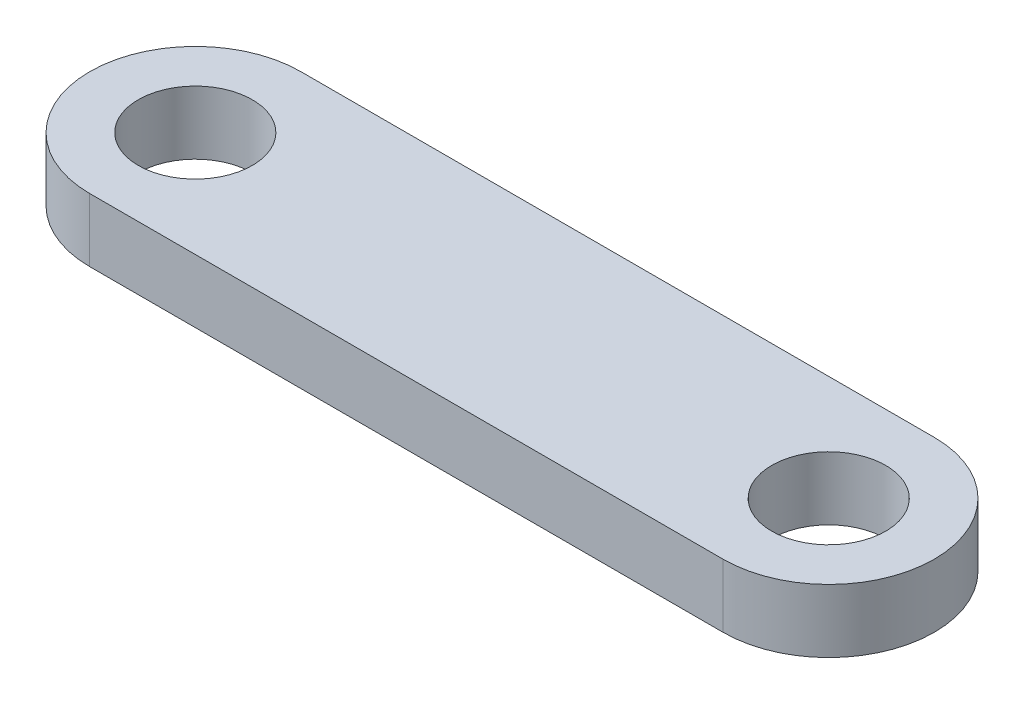
ISO-10303-21;
HEADER;
FILE_DESCRIPTION(('STEP AP214'),'2;1');
FILE_NAME('part.step','',(''),(''),'','','');
FILE_SCHEMA(('AUTOMOTIVE_DESIGN { 1 0 10303 214 1 1 1 1 }'));
ENDSEC;
DATA;
#1=APPLICATION_CONTEXT('core data for automotive mechanical design processes');
#2=APPLICATION_PROTOCOL_DEFINITION('international standard','automotive_design',2000,#1);
#3=PRODUCT_CONTEXT('',#1,'mechanical');
#4=PRODUCT('Part','Part','',(#3));
#5=PRODUCT_RELATED_PRODUCT_CATEGORY('part','',(#4));
#6=PRODUCT_DEFINITION_FORMATION('','',#4);
#7=PRODUCT_DEFINITION_CONTEXT('part definition',#1,'design');
#8=PRODUCT_DEFINITION('design','',#6,#7);
#9=PRODUCT_DEFINITION_SHAPE('','',#8);
#10=(LENGTH_UNIT() NAMED_UNIT(*) SI_UNIT(.MILLI.,.METRE.));
#11=(NAMED_UNIT(*) PLANE_ANGLE_UNIT() SI_UNIT($,.RADIAN.));
#12=(NAMED_UNIT(*) SI_UNIT($,.STERADIAN.) SOLID_ANGLE_UNIT());
#13=UNCERTAINTY_MEASURE_WITH_UNIT(LENGTH_MEASURE(1.E-05),#10,'distance_accuracy_value','');
#14=(GEOMETRIC_REPRESENTATION_CONTEXT(3) GLOBAL_UNCERTAINTY_ASSIGNED_CONTEXT((#13)) GLOBAL_UNIT_ASSIGNED_CONTEXT((#10,
#11,#12)) REPRESENTATION_CONTEXT('',''));
#15=CARTESIAN_POINT('',(0.,0.,0.));
#16=DIRECTION('',(0.,0.,1.));
#17=DIRECTION('',(1.,0.,0.));
#18=AXIS2_PLACEMENT_3D('',#15,#16,#17);
#19=CARTESIAN_POINT('',(0.,3.,0.));
#20=DIRECTION('',(0.,1.,0.));
#21=DIRECTION('',(0.,0.,1.));
#22=AXIS2_PLACEMENT_3D('',#19,#20,#21);
#23=PLANE('',#22);
#24=CARTESIAN_POINT('',(0.,3.,0.));
#25=DIRECTION('',(0.,1.,0.));
#26=DIRECTION('',(0.,0.,1.));
#27=AXIS2_PLACEMENT_3D('',#24,#25,#26);
#28=CIRCLE('',#27,2.7);
#29=CARTESIAN_POINT('',(0.,3.,2.7));
#30=VERTEX_POINT('',#29);
#31=EDGE_CURVE('E102',#30,#30,#28,.T.);
#32=ORIENTED_EDGE('',*,*,#31,.F.);
#33=EDGE_LOOP('',(#32));
#34=FACE_BOUND('',#33,.T.);
#35=CARTESIAN_POINT('',(0.,3.,0.));
#36=DIRECTION('',(0.,1.,0.));
#37=DIRECTION('',(0.,0.,1.));
#38=AXIS2_PLACEMENT_3D('',#35,#36,#37);
#39=CIRCLE('',#38,5.);
#40=CARTESIAN_POINT('',(0.,3.,-5.));
#41=VERTEX_POINT('',#40);
#42=CARTESIAN_POINT('',(0.,3.,5.));
#43=VERTEX_POINT('',#42);
#44=EDGE_CURVE('E87',#41,#43,#39,.T.);
#45=ORIENTED_EDGE('',*,*,#44,.T.);
#46=DIRECTION('',(1.,0.,0.));
#47=VECTOR('',#46,1.);
#48=CARTESIAN_POINT('',(0.,3.,5.));
#49=LINE('',#48,#47);
#50=CARTESIAN_POINT('',(30.,3.,5.));
#51=VERTEX_POINT('',#50);
#52=EDGE_CURVE('E82',#43,#51,#49,.T.);
#53=ORIENTED_EDGE('',*,*,#52,.T.);
#54=CARTESIAN_POINT('',(30.,3.,0.));
#55=DIRECTION('',(0.,1.,0.));
#56=DIRECTION('',(0.,0.,1.));
#57=AXIS2_PLACEMENT_3D('',#54,#55,#56);
#58=CIRCLE('',#57,5.);
#59=CARTESIAN_POINT('',(30.,3.,-5.));
#60=VERTEX_POINT('',#59);
#61=EDGE_CURVE('E85',#51,#60,#58,.T.);
#62=ORIENTED_EDGE('',*,*,#61,.T.);
#63=DIRECTION('',(-1.,0.,0.));
#64=VECTOR('',#63,1.);
#65=CARTESIAN_POINT('',(0.,3.,-5.));
#66=LINE('',#65,#64);
#67=EDGE_CURVE('E52',#60,#41,#66,.T.);
#68=ORIENTED_EDGE('',*,*,#67,.T.);
#69=EDGE_LOOP('',(#45,#53,#62,#68));
#70=FACE_BOUND('',#69,.T.);
#71=CARTESIAN_POINT('',(30.,3.,0.));
#72=DIRECTION('',(0.,1.,0.));
#73=DIRECTION('',(0.,0.,1.));
#74=AXIS2_PLACEMENT_3D('',#71,#72,#73);
#75=CIRCLE('',#74,2.7);
#76=CARTESIAN_POINT('',(30.,3.,2.7));
#77=VERTEX_POINT('',#76);
#78=EDGE_CURVE('E117',#77,#77,#75,.T.);
#79=ORIENTED_EDGE('',*,*,#78,.F.);
#80=EDGE_LOOP('',(#79));
#81=FACE_BOUND('',#80,.T.);
#82=ADVANCED_FACE('F35',(#34,#70,#81),#23,.T.);
#83=CARTESIAN_POINT('',(0.,0.,0.));
#84=DIRECTION('',(0.,1.,0.));
#85=DIRECTION('',(0.,0.,1.));
#86=AXIS2_PLACEMENT_3D('',#83,#84,#85);
#87=PLANE('',#86);
#88=CARTESIAN_POINT('',(0.,0.,0.));
#89=DIRECTION('',(0.,1.,0.));
#90=DIRECTION('',(0.,0.,1.));
#91=AXIS2_PLACEMENT_3D('',#88,#89,#90);
#92=CIRCLE('',#91,5.);
#93=CARTESIAN_POINT('',(0.,0.,-5.));
#94=VERTEX_POINT('',#93);
#95=CARTESIAN_POINT('',(0.,0.,5.));
#96=VERTEX_POINT('',#95);
#97=EDGE_CURVE('E99',#94,#96,#92,.T.);
#98=ORIENTED_EDGE('',*,*,#97,.F.);
#99=DIRECTION('',(-1.,0.,0.));
#100=VECTOR('',#99,1.);
#101=CARTESIAN_POINT('',(0.,0.,-5.));
#102=LINE('',#101,#100);
#103=CARTESIAN_POINT('',(30.,0.,-5.));
#104=VERTEX_POINT('',#103);
#105=EDGE_CURVE('E75',#104,#94,#102,.T.);
#106=ORIENTED_EDGE('',*,*,#105,.F.);
#107=CARTESIAN_POINT('',(30.,0.,0.));
#108=DIRECTION('',(0.,1.,0.));
#109=DIRECTION('',(0.,0.,1.));
#110=AXIS2_PLACEMENT_3D('',#107,#108,#109);
#111=CIRCLE('',#110,5.);
#112=CARTESIAN_POINT('',(30.,0.,5.));
#113=VERTEX_POINT('',#112);
#114=EDGE_CURVE('E69',#113,#104,#111,.T.);
#115=ORIENTED_EDGE('',*,*,#114,.F.);
#116=DIRECTION('',(1.,0.,0.));
#117=VECTOR('',#116,1.);
#118=CARTESIAN_POINT('',(0.,0.,5.));
#119=LINE('',#118,#117);
#120=EDGE_CURVE('E91',#96,#113,#119,.T.);
#121=ORIENTED_EDGE('',*,*,#120,.F.);
#122=EDGE_LOOP('',(#98,#106,#115,#121));
#123=FACE_BOUND('',#122,.T.);
#124=CARTESIAN_POINT('',(0.,0.,0.));
#125=DIRECTION('',(0.,1.,0.));
#126=DIRECTION('',(0.,0.,1.));
#127=AXIS2_PLACEMENT_3D('',#124,#125,#126);
#128=CIRCLE('',#127,2.7);
#129=CARTESIAN_POINT('',(0.,0.,2.7));
#130=VERTEX_POINT('',#129);
#131=EDGE_CURVE('E114',#130,#130,#128,.T.);
#132=ORIENTED_EDGE('',*,*,#131,.T.);
#133=EDGE_LOOP('',(#132));
#134=FACE_BOUND('',#133,.T.);
#135=CARTESIAN_POINT('',(30.,0.,0.));
#136=DIRECTION('',(0.,1.,0.));
#137=DIRECTION('',(0.,0.,1.));
#138=AXIS2_PLACEMENT_3D('',#135,#136,#137);
#139=CIRCLE('',#138,2.7);
#140=CARTESIAN_POINT('',(30.,0.,2.7));
#141=VERTEX_POINT('',#140);
#142=EDGE_CURVE('E120',#141,#141,#139,.T.);
#143=ORIENTED_EDGE('',*,*,#142,.T.);
#144=EDGE_LOOP('',(#143));
#145=FACE_BOUND('',#144,.T.);
#146=ADVANCED_FACE('F110',(#123,#134,#145),#87,.F.);
#147=CARTESIAN_POINT('',(0.,3.,0.));
#148=DIRECTION('',(0.,-1.,0.));
#149=DIRECTION('',(0.,0.,-1.));
#150=AXIS2_PLACEMENT_3D('',#147,#148,#149);
#151=CYLINDRICAL_SURFACE('',#150,5.);
#152=ORIENTED_EDGE('',*,*,#97,.T.);
#153=DIRECTION('',(0.,-1.,0.));
#154=VECTOR('',#153,1.);
#155=CARTESIAN_POINT('',(0.,3.,5.));
#156=LINE('',#155,#154);
#157=EDGE_CURVE('E11',#43,#96,#156,.T.);
#158=ORIENTED_EDGE('',*,*,#157,.F.);
#159=ORIENTED_EDGE('',*,*,#44,.F.);
#160=DIRECTION('',(0.,-1.,0.));
#161=VECTOR('',#160,1.);
#162=CARTESIAN_POINT('',(0.,3.,-5.));
#163=LINE('',#162,#161);
#164=EDGE_CURVE('E95',#41,#94,#163,.T.);
#165=ORIENTED_EDGE('',*,*,#164,.T.);
#166=EDGE_LOOP('',(#152,#158,#159,#165));
#167=FACE_BOUND('',#166,.T.);
#168=ADVANCED_FACE('F37',(#167),#151,.T.);
#169=CARTESIAN_POINT('',(0.,3.,5.));
#170=DIRECTION('',(0.,0.,-1.));
#171=DIRECTION('',(-1.,0.,0.));
#172=AXIS2_PLACEMENT_3D('',#169,#170,#171);
#173=PLANE('',#172);
#174=ORIENTED_EDGE('',*,*,#120,.T.);
#175=DIRECTION('',(0.,-1.,0.));
#176=VECTOR('',#175,1.);
#177=CARTESIAN_POINT('',(30.,3.,5.));
#178=LINE('',#177,#176);
#179=EDGE_CURVE('E44',#51,#113,#178,.T.);
#180=ORIENTED_EDGE('',*,*,#179,.F.);
#181=ORIENTED_EDGE('',*,*,#52,.F.);
#182=ORIENTED_EDGE('',*,*,#157,.T.);
#183=EDGE_LOOP('',(#174,#180,#181,#182));
#184=FACE_BOUND('',#183,.T.);
#185=ADVANCED_FACE('F90',(#184),#173,.F.);
#186=CARTESIAN_POINT('',(30.,3.,0.));
#187=DIRECTION('',(0.,-1.,0.));
#188=DIRECTION('',(0.,0.,-1.));
#189=AXIS2_PLACEMENT_3D('',#186,#187,#188);
#190=CYLINDRICAL_SURFACE('',#189,5.);
#191=ORIENTED_EDGE('',*,*,#114,.T.);
#192=DIRECTION('',(0.,-1.,0.));
#193=VECTOR('',#192,1.);
#194=CARTESIAN_POINT('',(30.,3.,-5.));
#195=LINE('',#194,#193);
#196=EDGE_CURVE('E92',#60,#104,#195,.T.);
#197=ORIENTED_EDGE('',*,*,#196,.F.);
#198=ORIENTED_EDGE('',*,*,#61,.F.);
#199=ORIENTED_EDGE('',*,*,#179,.T.);
#200=EDGE_LOOP('',(#191,#197,#198,#199));
#201=FACE_BOUND('',#200,.T.);
#202=ADVANCED_FACE('F93',(#201),#190,.T.);
#203=CARTESIAN_POINT('',(0.,3.,-5.));
#204=DIRECTION('',(0.,0.,1.));
#205=DIRECTION('',(1.,0.,0.));
#206=AXIS2_PLACEMENT_3D('',#203,#204,#205);
#207=PLANE('',#206);
#208=ORIENTED_EDGE('',*,*,#105,.T.);
#209=ORIENTED_EDGE('',*,*,#164,.F.);
#210=ORIENTED_EDGE('',*,*,#67,.F.);
#211=ORIENTED_EDGE('',*,*,#196,.T.);
#212=EDGE_LOOP('',(#208,#209,#210,#211));
#213=FACE_BOUND('',#212,.T.);
#214=ADVANCED_FACE('F107',(#213),#207,.F.);
#215=CARTESIAN_POINT('',(0.,3.,0.));
#216=DIRECTION('',(0.,-1.,0.));
#217=DIRECTION('',(0.,0.,-1.));
#218=AXIS2_PLACEMENT_3D('',#215,#216,#217);
#219=CYLINDRICAL_SURFACE('',#218,2.7);
#220=ORIENTED_EDGE('',*,*,#31,.T.);
#221=EDGE_LOOP('',(#220));
#222=FACE_BOUND('',#221,.T.);
#223=ORIENTED_EDGE('',*,*,#131,.F.);
#224=EDGE_LOOP('',(#223));
#225=FACE_BOUND('',#224,.T.);
#226=ADVANCED_FACE('F137',(#222,#225),#219,.F.);
#227=CARTESIAN_POINT('',(30.,3.,0.));
#228=DIRECTION('',(0.,-1.,0.));
#229=DIRECTION('',(0.,0.,-1.));
#230=AXIS2_PLACEMENT_3D('',#227,#228,#229);
#231=CYLINDRICAL_SURFACE('',#230,2.7);
#232=ORIENTED_EDGE('',*,*,#78,.T.);
#233=EDGE_LOOP('',(#232));
#234=FACE_BOUND('',#233,.T.);
#235=ORIENTED_EDGE('',*,*,#142,.F.);
#236=EDGE_LOOP('',(#235));
#237=FACE_BOUND('',#236,.T.);
#238=ADVANCED_FACE('F126',(#234,#237),#231,.F.);
#239=CLOSED_SHELL('',(#82,#146,#168,#185,#202,#214,#226,#238));
#240=MANIFOLD_SOLID_BREP('B2',#239);
#241=ADVANCED_BREP_SHAPE_REPRESENTATION('',(#18,#240),#14);
#242=SHAPE_DEFINITION_REPRESENTATION(#9,#241);
ENDSEC;
END-ISO-10303-21;
